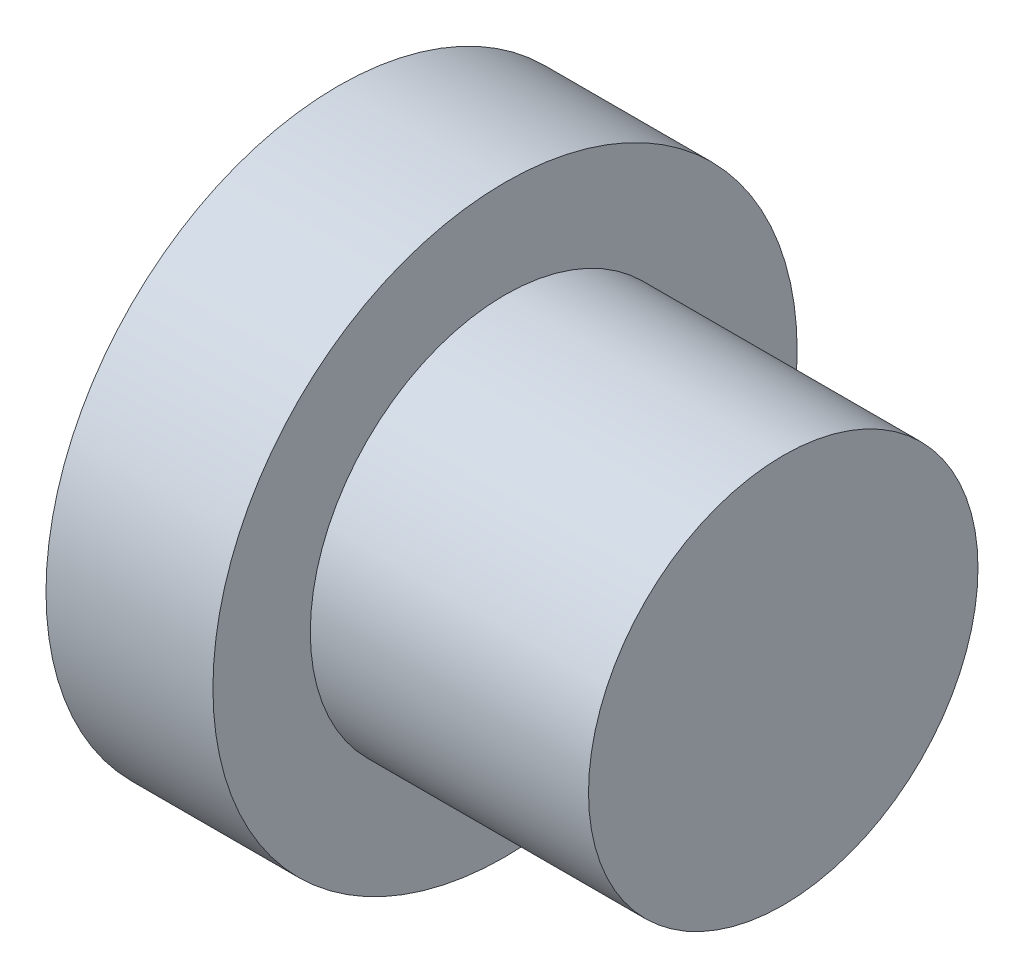
ISO-10303-21;
HEADER;
FILE_DESCRIPTION(('STEP AP214'),'2;1');
FILE_NAME('part.step','',(''),(''),'','','');
FILE_SCHEMA(('AUTOMOTIVE_DESIGN { 1 0 10303 214 1 1 1 1 }'));
ENDSEC;
DATA;
#1=APPLICATION_CONTEXT('core data for automotive mechanical design processes');
#2=APPLICATION_PROTOCOL_DEFINITION('international standard','automotive_design',2000,#1);
#3=PRODUCT_CONTEXT('',#1,'mechanical');
#4=PRODUCT('Part','Part','',(#3));
#5=PRODUCT_RELATED_PRODUCT_CATEGORY('part','',(#4));
#6=PRODUCT_DEFINITION_FORMATION('','',#4);
#7=PRODUCT_DEFINITION_CONTEXT('part definition',#1,'design');
#8=PRODUCT_DEFINITION('design','',#6,#7);
#9=PRODUCT_DEFINITION_SHAPE('','',#8);
#10=(LENGTH_UNIT() NAMED_UNIT(*) SI_UNIT(.MILLI.,.METRE.));
#11=(NAMED_UNIT(*) PLANE_ANGLE_UNIT() SI_UNIT($,.RADIAN.));
#12=(NAMED_UNIT(*) SI_UNIT($,.STERADIAN.) SOLID_ANGLE_UNIT());
#13=UNCERTAINTY_MEASURE_WITH_UNIT(LENGTH_MEASURE(1.E-05),#10,'distance_accuracy_value','');
#14=(GEOMETRIC_REPRESENTATION_CONTEXT(3) GLOBAL_UNCERTAINTY_ASSIGNED_CONTEXT((#13)) GLOBAL_UNIT_ASSIGNED_CONTEXT((#10,
#11,#12)) REPRESENTATION_CONTEXT('',''));
#15=CARTESIAN_POINT('',(0.,0.,0.));
#16=DIRECTION('',(0.,0.,1.));
#17=DIRECTION('',(1.,0.,0.));
#18=AXIS2_PLACEMENT_3D('',#15,#16,#17);
#19=CARTESIAN_POINT('',(3.,0.,0.));
#20=DIRECTION('',(1.,0.,0.));
#21=DIRECTION('',(0.,0.,-1.));
#22=AXIS2_PLACEMENT_3D('',#19,#20,#21);
#23=PLANE('',#22);
#24=CARTESIAN_POINT('',(3.,0.,0.));
#25=DIRECTION('',(1.,0.,0.));
#26=DIRECTION('',(0.,0.,-1.));
#27=AXIS2_PLACEMENT_3D('',#24,#25,#26);
#28=CIRCLE('',#27,5.25);
#29=CARTESIAN_POINT('',(3.,0.,-5.25));
#30=VERTEX_POINT('',#29);
#31=EDGE_CURVE('E10',#30,#30,#28,.T.);
#32=ORIENTED_EDGE('',*,*,#31,.T.);
#33=EDGE_LOOP('',(#32));
#34=FACE_BOUND('',#33,.T.);
#35=CARTESIAN_POINT('',(3.,0.,0.));
#36=DIRECTION('',(1.,0.,0.));
#37=DIRECTION('',(0.,0.,-1.));
#38=AXIS2_PLACEMENT_3D('',#35,#36,#37);
#39=CIRCLE('',#38,3.5);
#40=CARTESIAN_POINT('',(3.,0.,-3.5));
#41=VERTEX_POINT('',#40);
#42=EDGE_CURVE('E43',#41,#41,#39,.T.);
#43=ORIENTED_EDGE('',*,*,#42,.F.);
#44=EDGE_LOOP('',(#43));
#45=FACE_BOUND('',#44,.T.);
#46=ADVANCED_FACE('F30',(#34,#45),#23,.T.);
#47=CARTESIAN_POINT('',(3.,0.,0.));
#48=DIRECTION('',(-1.,0.,0.));
#49=DIRECTION('',(0.,0.,1.));
#50=AXIS2_PLACEMENT_3D('',#47,#48,#49);
#51=CYLINDRICAL_SURFACE('',#50,5.25);
#52=ORIENTED_EDGE('',*,*,#31,.F.);
#53=EDGE_LOOP('',(#52));
#54=FACE_BOUND('',#53,.T.);
#55=CARTESIAN_POINT('',(0.,0.,0.));
#56=DIRECTION('',(1.,0.,0.));
#57=DIRECTION('',(0.,0.,-1.));
#58=AXIS2_PLACEMENT_3D('',#55,#56,#57);
#59=CIRCLE('',#58,5.25);
#60=CARTESIAN_POINT('',(0.,0.,-5.25));
#61=VERTEX_POINT('',#60);
#62=EDGE_CURVE('E34',#61,#61,#59,.T.);
#63=ORIENTED_EDGE('',*,*,#62,.T.);
#64=EDGE_LOOP('',(#63));
#65=FACE_BOUND('',#64,.T.);
#66=ADVANCED_FACE('F32',(#54,#65),#51,.T.);
#67=CARTESIAN_POINT('',(0.,0.,0.));
#68=DIRECTION('',(1.,0.,0.));
#69=DIRECTION('',(0.,0.,-1.));
#70=AXIS2_PLACEMENT_3D('',#67,#68,#69);
#71=PLANE('',#70);
#72=ORIENTED_EDGE('',*,*,#62,.F.);
#73=EDGE_LOOP('',(#72));
#74=FACE_BOUND('',#73,.T.);
#75=ADVANCED_FACE('F54',(#74),#71,.F.);
#76=CARTESIAN_POINT('',(8.,0.,0.));
#77=DIRECTION('',(-1.,0.,0.));
#78=DIRECTION('',(0.,0.,1.));
#79=AXIS2_PLACEMENT_3D('',#76,#77,#78);
#80=CYLINDRICAL_SURFACE('',#79,3.5);
#81=CARTESIAN_POINT('',(8.,0.,0.));
#82=DIRECTION('',(1.,0.,0.));
#83=DIRECTION('',(0.,0.,-1.));
#84=AXIS2_PLACEMENT_3D('',#81,#82,#83);
#85=CIRCLE('',#84,3.5);
#86=CARTESIAN_POINT('',(8.,0.,-3.5));
#87=VERTEX_POINT('',#86);
#88=EDGE_CURVE('E41',#87,#87,#85,.T.);
#89=ORIENTED_EDGE('',*,*,#88,.F.);
#90=EDGE_LOOP('',(#89));
#91=FACE_BOUND('',#90,.T.);
#92=ORIENTED_EDGE('',*,*,#42,.T.);
#93=EDGE_LOOP('',(#92));
#94=FACE_BOUND('',#93,.T.);
#95=ADVANCED_FACE('F51',(#91,#94),#80,.T.);
#96=CARTESIAN_POINT('',(8.,0.,0.));
#97=DIRECTION('',(1.,0.,0.));
#98=DIRECTION('',(0.,0.,-1.));
#99=AXIS2_PLACEMENT_3D('',#96,#97,#98);
#100=PLANE('',#99);
#101=ORIENTED_EDGE('',*,*,#88,.T.);
#102=EDGE_LOOP('',(#101));
#103=FACE_BOUND('',#102,.T.);
#104=ADVANCED_FACE('F49',(#103),#100,.T.);
#105=CLOSED_SHELL('',(#46,#66,#75,#95,#104));
#106=MANIFOLD_SOLID_BREP('B2',#105);
#107=ADVANCED_BREP_SHAPE_REPRESENTATION('',(#18,#106),#14);
#108=SHAPE_DEFINITION_REPRESENTATION(#9,#107);
ENDSEC;
END-ISO-10303-21;
